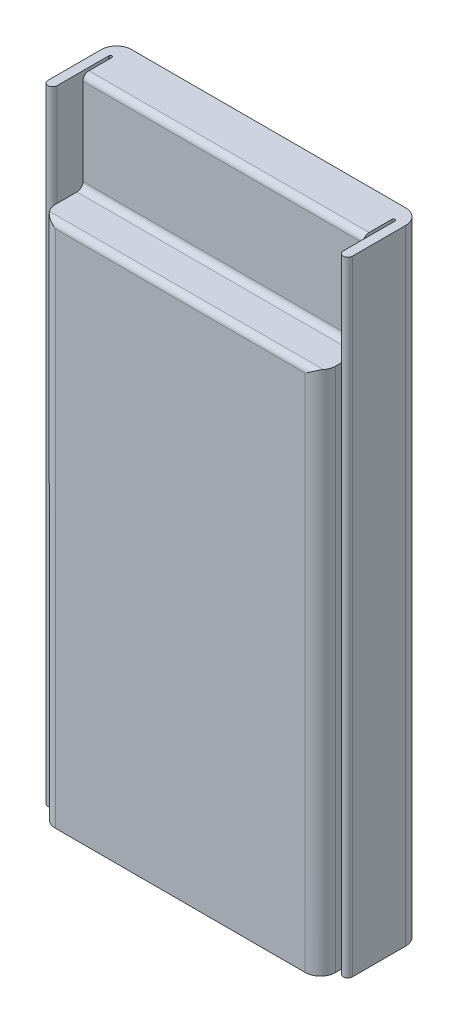
ISO-10303-21;
HEADER;
FILE_DESCRIPTION(('STEP AP214'),'2;1');
FILE_NAME('part.step','',(''),(''),'','','');
FILE_SCHEMA(('AUTOMOTIVE_DESIGN { 1 0 10303 214 1 1 1 1 }'));
ENDSEC;
DATA;
#1=APPLICATION_CONTEXT('core data for automotive mechanical design processes');
#2=APPLICATION_PROTOCOL_DEFINITION('international standard','automotive_design',2000,#1);
#3=PRODUCT_CONTEXT('',#1,'mechanical');
#4=PRODUCT('Part','Part','',(#3));
#5=PRODUCT_RELATED_PRODUCT_CATEGORY('part','',(#4));
#6=PRODUCT_DEFINITION_FORMATION('','',#4);
#7=PRODUCT_DEFINITION_CONTEXT('part definition',#1,'design');
#8=PRODUCT_DEFINITION('design','',#6,#7);
#9=PRODUCT_DEFINITION_SHAPE('','',#8);
#10=(LENGTH_UNIT() NAMED_UNIT(*) SI_UNIT(.MILLI.,.METRE.));
#11=(NAMED_UNIT(*) PLANE_ANGLE_UNIT() SI_UNIT($,.RADIAN.));
#12=(NAMED_UNIT(*) SI_UNIT($,.STERADIAN.) SOLID_ANGLE_UNIT());
#13=UNCERTAINTY_MEASURE_WITH_UNIT(LENGTH_MEASURE(1.E-05),#10,'distance_accuracy_value','');
#14=(GEOMETRIC_REPRESENTATION_CONTEXT(3) GLOBAL_UNCERTAINTY_ASSIGNED_CONTEXT((#13)) GLOBAL_UNIT_ASSIGNED_CONTEXT((#10,
#11,#12)) REPRESENTATION_CONTEXT('',''));
#15=CARTESIAN_POINT('',(0.,0.,0.));
#16=DIRECTION('',(0.,0.,1.));
#17=DIRECTION('',(1.,0.,0.));
#18=AXIS2_PLACEMENT_3D('',#15,#16,#17);
#19=CARTESIAN_POINT('',(-9.2,20.5,4.8));
#20=DIRECTION('',(1.,0.,0.));
#21=DIRECTION('',(0.,0.,-1.));
#22=AXIS2_PLACEMENT_3D('',#19,#20,#21);
#23=PLANE('',#22);
#24=CARTESIAN_POINT('',(-9.2,20.1,2.6));
#25=DIRECTION('',(1.,0.,0.));
#26=DIRECTION('',(0.,0.,-1.));
#27=AXIS2_PLACEMENT_3D('',#24,#25,#26);
#28=CIRCLE('',#27,0.400000000000001);
#29=CARTESIAN_POINT('',(-9.2,20.5,2.6));
#30=VERTEX_POINT('',#29);
#31=CARTESIAN_POINT('',(-9.2,20.1,3.));
#32=VERTEX_POINT('',#31);
#33=EDGE_CURVE('E320',#30,#32,#28,.T.);
#34=ORIENTED_EDGE('',*,*,#33,.F.);
#35=DIRECTION('',(0.,0.,1.));
#36=VECTOR('',#35,1.);
#37=CARTESIAN_POINT('',(-9.2,20.5,4.8));
#38=LINE('',#37,#36);
#39=CARTESIAN_POINT('',(-9.2,20.5,1.1));
#40=VERTEX_POINT('',#39);
#41=EDGE_CURVE('E269',#40,#30,#38,.T.);
#42=ORIENTED_EDGE('',*,*,#41,.F.);
#43=DIRECTION('',(0.,-1.,0.));
#44=VECTOR('',#43,1.);
#45=CARTESIAN_POINT('',(-9.2,20.5,1.1));
#46=LINE('',#45,#44);
#47=CARTESIAN_POINT('',(-9.2,-20.5,1.1));
#48=VERTEX_POINT('',#47);
#49=EDGE_CURVE('E237',#40,#48,#46,.T.);
#50=ORIENTED_EDGE('',*,*,#49,.T.);
#51=DIRECTION('',(0.,0.,1.));
#52=VECTOR('',#51,1.);
#53=CARTESIAN_POINT('',(-9.2,-20.5,4.8));
#54=LINE('',#53,#52);
#55=CARTESIAN_POINT('',(-9.2,-20.5,4.8));
#56=VERTEX_POINT('',#55);
#57=EDGE_CURVE('E192',#48,#56,#54,.T.);
#58=ORIENTED_EDGE('',*,*,#57,.T.);
#59=DIRECTION('',(0.,-1.,0.));
#60=VECTOR('',#59,1.);
#61=CARTESIAN_POINT('',(-9.2,20.5,4.8));
#62=LINE('',#61,#60);
#63=CARTESIAN_POINT('',(-9.2,14.,4.8));
#64=VERTEX_POINT('',#63);
#65=EDGE_CURVE('E235',#64,#56,#62,.T.);
#66=ORIENTED_EDGE('',*,*,#65,.F.);
#67=DIRECTION('',(0.,0.,1.));
#68=VECTOR('',#67,1.);
#69=CARTESIAN_POINT('',(-9.2,14.,3.4));
#70=LINE('',#69,#68);
#71=CARTESIAN_POINT('',(-9.2,14.,3.4));
#72=VERTEX_POINT('',#71);
#73=EDGE_CURVE('E551',#72,#64,#70,.T.);
#74=ORIENTED_EDGE('',*,*,#73,.F.);
#75=CARTESIAN_POINT('',(-9.2,14.4,3.4));
#76=DIRECTION('',(1.,0.,0.));
#77=DIRECTION('',(0.,0.,-1.));
#78=AXIS2_PLACEMENT_3D('',#75,#76,#77);
#79=CIRCLE('',#78,0.4);
#80=CARTESIAN_POINT('',(-9.2,14.4,3.));
#81=VERTEX_POINT('',#80);
#82=EDGE_CURVE('E565',#81,#72,#79,.F.);
#83=ORIENTED_EDGE('',*,*,#82,.F.);
#84=DIRECTION('',(0.,-1.,0.));
#85=VECTOR('',#84,1.);
#86=CARTESIAN_POINT('',(-9.2,20.1,3.));
#87=LINE('',#86,#85);
#88=EDGE_CURVE('E568',#32,#81,#87,.T.);
#89=ORIENTED_EDGE('',*,*,#88,.F.);
#90=EDGE_LOOP('',(#34,#42,#50,#58,#66,#74,#83,#89));
#91=FACE_BOUND('',#90,.T.);
#92=ADVANCED_FACE('F35',(#91),#23,.F.);
#93=CARTESIAN_POINT('',(-8.2,20.5,4.8));
#94=DIRECTION('',(0.,-1.,0.));
#95=DIRECTION('',(0.,0.,-1.));
#96=AXIS2_PLACEMENT_3D('',#93,#94,#95);
#97=CYLINDRICAL_SURFACE('',#96,1.);
#98=CARTESIAN_POINT('',(-9.,14.,5.4));
#99=CARTESIAN_POINT('',(-8.97946555578519,13.999963502659,5.42742158688643));
#100=CARTESIAN_POINT('',(-8.95759830631048,13.997191577115,5.45360470949974));
#101=CARTESIAN_POINT('',(-8.91200033520255,13.9873375955562,5.5029645742072));
#102=CARTESIAN_POINT('',(-8.88828992837434,13.9802979548521,5.5261682126742));
#103=CARTESIAN_POINT('',(-8.82900594180071,13.9593597466306,5.57879996658453));
#104=CARTESIAN_POINT('',(-8.79266811241833,13.9438182116337,5.6066906262616));
#105=CARTESIAN_POINT('',(-8.71791017121064,13.9083623370661,5.65662413275789));
#106=CARTESIAN_POINT('',(-8.67947861979782,13.8884216722672,5.67862993057854));
#107=CARTESIAN_POINT('',(-8.58519541916724,13.8368522731022,5.72488471521433));
#108=CARTESIAN_POINT('',(-8.52872579474069,13.8038047508953,5.7462829915298));
#109=CARTESIAN_POINT('',(-8.41473104532002,13.7349288005911,5.77846495796601));
#110=CARTESIAN_POINT('',(-8.3572080468762,13.6991055857251,5.78926805013529));
#111=CARTESIAN_POINT('',(-8.2681605265798,13.6431017838825,5.79817080641198));
#112=CARTESIAN_POINT('',(-8.23675096803131,13.6232429928825,5.79981786747484));
#113=CARTESIAN_POINT('',(-8.20356347320432,13.6022537396361,5.79999523668233));
#114=CARTESIAN_POINT('',(-8.20178172569562,13.6011268636092,5.79999999807849));
#115=CARTESIAN_POINT('',(-8.2,13.6,5.8));
#116=B_SPLINE_CURVE_WITH_KNOTS('',3,(#98,#99,#100,#101,#102,#103,#104,#105,#106,#107,#108,#109,
#110,#111,#112,#113,#114,#115),.UNSPECIFIED.,.F.,.F.,(4,2,2,2,2,2,2,2,4),(0.,0.102339866834812,
0.203678917670562,0.348024697625991,0.493258904873182,0.698689883440692,0.903743967608915,
1.01522241349045,1.02154698494518),.UNSPECIFIED.);
#117=CARTESIAN_POINT('',(-9.,14.,5.4));
#118=VERTEX_POINT('',#117);
#119=CARTESIAN_POINT('',(-8.2,13.6,5.8));
#120=VERTEX_POINT('',#119);
#121=EDGE_CURVE('E538',#118,#120,#116,.T.);
#122=ORIENTED_EDGE('',*,*,#121,.F.);
#123=CARTESIAN_POINT('',(-8.2,14.,4.8));
#124=DIRECTION('',(0.,-1.,0.));
#125=DIRECTION('',(0.,0.,-1.));
#126=AXIS2_PLACEMENT_3D('',#123,#124,#125);
#127=CIRCLE('',#126,1.);
#128=EDGE_CURVE('E547',#64,#118,#127,.F.);
#129=ORIENTED_EDGE('',*,*,#128,.F.);
#130=ORIENTED_EDGE('',*,*,#65,.T.);
#131=CARTESIAN_POINT('',(-8.2,-20.5,4.8));
#132=DIRECTION('',(0.,1.,0.));
#133=DIRECTION('',(0.,0.,1.));
#134=AXIS2_PLACEMENT_3D('',#131,#132,#133);
#135=CIRCLE('',#134,1.);
#136=CARTESIAN_POINT('',(-8.2,-20.5,5.8));
#137=VERTEX_POINT('',#136);
#138=EDGE_CURVE('E195',#56,#137,#135,.T.);
#139=ORIENTED_EDGE('',*,*,#138,.T.);
#140=DIRECTION('',(0.,-1.,0.));
#141=VECTOR('',#140,1.);
#142=CARTESIAN_POINT('',(-8.2,20.5,5.8));
#143=LINE('',#142,#141);
#144=EDGE_CURVE('E233',#120,#137,#143,.T.);
#145=ORIENTED_EDGE('',*,*,#144,.F.);
#146=EDGE_LOOP('',(#122,#129,#130,#139,#145));
#147=FACE_BOUND('',#146,.T.);
#148=ADVANCED_FACE('F376',(#147),#97,.T.);
#149=CARTESIAN_POINT('',(8.2,20.5,4.8));
#150=DIRECTION('',(0.,-1.,0.));
#151=DIRECTION('',(0.,0.,-1.));
#152=AXIS2_PLACEMENT_3D('',#149,#150,#151);
#153=CYLINDRICAL_SURFACE('',#152,1.);
#154=CARTESIAN_POINT('',(9.,14.,5.4));
#155=CARTESIAN_POINT('',(8.97946555578519,13.999963502659,5.42742158688643));
#156=CARTESIAN_POINT('',(8.95759830631047,13.997191577115,5.45360470949974));
#157=CARTESIAN_POINT('',(8.91200033520254,13.9873375955562,5.50296457420721));
#158=CARTESIAN_POINT('',(8.88828992837433,13.9802979548521,5.5261682126742));
#159=CARTESIAN_POINT('',(8.82900594180071,13.9593597466306,5.57879996658453));
#160=CARTESIAN_POINT('',(8.79266811241833,13.9438182116336,5.6066906262616));
#161=CARTESIAN_POINT('',(8.71791017121064,13.9083623370661,5.65662413275788));
#162=CARTESIAN_POINT('',(8.67947861979781,13.8884216722672,5.67862993057854));
#163=CARTESIAN_POINT('',(8.58519541916724,13.8368522731022,5.72488471521433));
#164=CARTESIAN_POINT('',(8.52872579474073,13.8038047508952,5.7462829915298));
#165=CARTESIAN_POINT('',(8.41473104531996,13.7349288005911,5.77846495796601));
#166=CARTESIAN_POINT('',(8.357208046876,13.6991055857254,5.7892680501353));
#167=CARTESIAN_POINT('',(8.2681605265799,13.6431017838823,5.79817080641197));
#168=CARTESIAN_POINT('',(8.23675096803162,13.623242992882,5.79981786747483));
#169=CARTESIAN_POINT('',(8.20356347320435,13.602253739636,5.79999523668233));
#170=CARTESIAN_POINT('',(8.20178172569563,13.6011268636092,5.79999999807849));
#171=CARTESIAN_POINT('',(8.2,13.6,5.8));
#172=B_SPLINE_CURVE_WITH_KNOTS('',3,(#154,#155,#156,#157,#158,#159,#160,#161,#162,#163,#164,
#165,#166,#167,#168,#169,#170,#171),.UNSPECIFIED.,.F.,.F.,(4,2,2,2,2,2,2,2,4),(0.,
0.102339866834819,0.203678917670562,0.348024697625981,0.493258904873183,0.698689883440703,
0.903743967608915,1.01522241349045,1.02154698494518),.UNSPECIFIED.);
#173=CARTESIAN_POINT('',(9.,14.,5.4));
#174=VERTEX_POINT('',#173);
#175=CARTESIAN_POINT('',(8.2,13.6,5.8));
#176=VERTEX_POINT('',#175);
#177=EDGE_CURVE('E310',#174,#176,#172,.T.);
#178=ORIENTED_EDGE('',*,*,#177,.T.);
#179=DIRECTION('',(0.,-1.,0.));
#180=VECTOR('',#179,1.);
#181=CARTESIAN_POINT('',(8.2,20.5,5.8));
#182=LINE('',#181,#180);
#183=CARTESIAN_POINT('',(8.2,-20.5,5.8));
#184=VERTEX_POINT('',#183);
#185=EDGE_CURVE('E231',#176,#184,#182,.T.);
#186=ORIENTED_EDGE('',*,*,#185,.T.);
#187=CARTESIAN_POINT('',(8.2,-20.5,4.8));
#188=DIRECTION('',(0.,1.,0.));
#189=DIRECTION('',(0.,0.,-1.));
#190=AXIS2_PLACEMENT_3D('',#187,#188,#189);
#191=CIRCLE('',#190,1.);
#192=CARTESIAN_POINT('',(9.2,-20.5,4.8));
#193=VERTEX_POINT('',#192);
#194=EDGE_CURVE('E201',#184,#193,#191,.T.);
#195=ORIENTED_EDGE('',*,*,#194,.T.);
#196=DIRECTION('',(0.,-1.,0.));
#197=VECTOR('',#196,1.);
#198=CARTESIAN_POINT('',(9.2,20.5,4.8));
#199=LINE('',#198,#197);
#200=CARTESIAN_POINT('',(9.2,14.,4.8));
#201=VERTEX_POINT('',#200);
#202=EDGE_CURVE('E229',#201,#193,#199,.T.);
#203=ORIENTED_EDGE('',*,*,#202,.F.);
#204=CARTESIAN_POINT('',(8.2,14.,4.8));
#205=DIRECTION('',(0.,1.,0.));
#206=DIRECTION('',(0.,0.,1.));
#207=AXIS2_PLACEMENT_3D('',#204,#205,#206);
#208=CIRCLE('',#207,1.);
#209=EDGE_CURVE('E317',#201,#174,#208,.F.);
#210=ORIENTED_EDGE('',*,*,#209,.T.);
#211=EDGE_LOOP('',(#178,#186,#195,#203,#210));
#212=FACE_BOUND('',#211,.T.);
#213=ADVANCED_FACE('F372',(#212),#153,.T.);
#214=CARTESIAN_POINT('',(9.2,20.5,1.1));
#215=DIRECTION('',(-1.,0.,0.));
#216=DIRECTION('',(0.,0.,1.));
#217=AXIS2_PLACEMENT_3D('',#214,#215,#216);
#218=PLANE('',#217);
#219=CARTESIAN_POINT('',(9.2,20.1,2.6));
#220=DIRECTION('',(-1.,0.,0.));
#221=DIRECTION('',(0.,0.,1.));
#222=AXIS2_PLACEMENT_3D('',#219,#220,#221);
#223=CIRCLE('',#222,0.400000000000001);
#224=CARTESIAN_POINT('',(9.2,20.5,2.6));
#225=VERTEX_POINT('',#224);
#226=CARTESIAN_POINT('',(9.2,20.1,3.));
#227=VERTEX_POINT('',#226);
#228=EDGE_CURVE('E50',#225,#227,#223,.F.);
#229=ORIENTED_EDGE('',*,*,#228,.T.);
#230=DIRECTION('',(0.,-1.,0.));
#231=VECTOR('',#230,1.);
#232=CARTESIAN_POINT('',(9.2,20.1,3.));
#233=LINE('',#232,#231);
#234=CARTESIAN_POINT('',(9.2,14.4,3.));
#235=VERTEX_POINT('',#234);
#236=EDGE_CURVE('E304',#227,#235,#233,.T.);
#237=ORIENTED_EDGE('',*,*,#236,.T.);
#238=CARTESIAN_POINT('',(9.2,14.4,3.4));
#239=DIRECTION('',(-1.,0.,0.));
#240=DIRECTION('',(0.,0.,1.));
#241=AXIS2_PLACEMENT_3D('',#238,#239,#240);
#242=CIRCLE('',#241,0.4);
#243=CARTESIAN_POINT('',(9.2,14.,3.4));
#244=VERTEX_POINT('',#243);
#245=EDGE_CURVE('E308',#235,#244,#242,.T.);
#246=ORIENTED_EDGE('',*,*,#245,.T.);
#247=DIRECTION('',(0.,0.,1.));
#248=VECTOR('',#247,1.);
#249=CARTESIAN_POINT('',(9.2,14.,3.4));
#250=LINE('',#249,#248);
#251=EDGE_CURVE('E314',#244,#201,#250,.T.);
#252=ORIENTED_EDGE('',*,*,#251,.T.);
#253=ORIENTED_EDGE('',*,*,#202,.T.);
#254=DIRECTION('',(0.,0.,-1.));
#255=VECTOR('',#254,1.);
#256=CARTESIAN_POINT('',(9.2,-20.5,1.1));
#257=LINE('',#256,#255);
#258=CARTESIAN_POINT('',(9.2,-20.5,1.1));
#259=VERTEX_POINT('',#258);
#260=EDGE_CURVE('E204',#193,#259,#257,.T.);
#261=ORIENTED_EDGE('',*,*,#260,.T.);
#262=DIRECTION('',(0.,-1.,0.));
#263=VECTOR('',#262,1.);
#264=CARTESIAN_POINT('',(9.2,20.5,1.1));
#265=LINE('',#264,#263);
#266=CARTESIAN_POINT('',(9.2,20.5,1.1));
#267=VERTEX_POINT('',#266);
#268=EDGE_CURVE('E226',#267,#259,#265,.T.);
#269=ORIENTED_EDGE('',*,*,#268,.F.);
#270=DIRECTION('',(0.,0.,-1.));
#271=VECTOR('',#270,1.);
#272=CARTESIAN_POINT('',(9.2,20.5,1.1));
#273=LINE('',#272,#271);
#274=EDGE_CURVE('E272',#225,#267,#273,.T.);
#275=ORIENTED_EDGE('',*,*,#274,.F.);
#276=EDGE_LOOP('',(#229,#237,#246,#252,#253,#261,#269,#275));
#277=FACE_BOUND('',#276,.T.);
#278=ADVANCED_FACE('F369',(#277),#218,.F.);
#279=CARTESIAN_POINT('',(-9.,20.5,0.999999999999998));
#280=DIRECTION('',(0.,-1.,0.));
#281=DIRECTION('',(0.,0.,-1.));
#282=AXIS2_PLACEMENT_3D('',#279,#280,#281);
#283=CYLINDRICAL_SURFACE('',#282,0.999999999999999);
#284=CARTESIAN_POINT('',(-9.,-20.5,0.999999999999998));
#285=DIRECTION('',(0.,1.,0.));
#286=DIRECTION('',(0.,0.,1.));
#287=AXIS2_PLACEMENT_3D('',#284,#285,#286);
#288=CIRCLE('',#287,0.999999999999999);
#289=CARTESIAN_POINT('',(-9.,-20.5,0.));
#290=VERTEX_POINT('',#289);
#291=CARTESIAN_POINT('',(-10.,-20.5,1.));
#292=VERTEX_POINT('',#291);
#293=EDGE_CURVE('E180',#290,#292,#288,.T.);
#294=ORIENTED_EDGE('',*,*,#293,.T.);
#295=DIRECTION('',(0.,-1.,0.));
#296=VECTOR('',#295,1.);
#297=CARTESIAN_POINT('',(-10.,20.5,1.));
#298=LINE('',#297,#296);
#299=CARTESIAN_POINT('',(-10.,20.5,1.));
#300=VERTEX_POINT('',#299);
#301=EDGE_CURVE('E11',#300,#292,#298,.T.);
#302=ORIENTED_EDGE('',*,*,#301,.F.);
#303=CARTESIAN_POINT('',(-9.,20.5,0.999999999999998));
#304=DIRECTION('',(0.,1.,0.));
#305=DIRECTION('',(0.,0.,1.));
#306=AXIS2_PLACEMENT_3D('',#303,#304,#305);
#307=CIRCLE('',#306,0.999999999999999);
#308=CARTESIAN_POINT('',(-9.,20.5,0.));
#309=VERTEX_POINT('',#308);
#310=EDGE_CURVE('E216',#309,#300,#307,.T.);
#311=ORIENTED_EDGE('',*,*,#310,.F.);
#312=DIRECTION('',(0.,-1.,0.));
#313=VECTOR('',#312,1.);
#314=CARTESIAN_POINT('',(-9.,20.5,0.));
#315=LINE('',#314,#313);
#316=EDGE_CURVE('E176',#309,#290,#315,.T.);
#317=ORIENTED_EDGE('',*,*,#316,.T.);
#318=EDGE_LOOP('',(#294,#302,#311,#317));
#319=FACE_BOUND('',#318,.T.);
#320=ADVANCED_FACE('F37',(#319),#283,.T.);
#321=CARTESIAN_POINT('',(-10.,20.5,1.));
#322=DIRECTION('',(1.,0.,0.));
#323=DIRECTION('',(0.,0.,-1.));
#324=AXIS2_PLACEMENT_3D('',#321,#322,#323);
#325=PLANE('',#324);
#326=DIRECTION('',(0.,0.,1.));
#327=VECTOR('',#326,1.);
#328=CARTESIAN_POINT('',(-10.,-20.5,1.));
#329=LINE('',#328,#327);
#330=CARTESIAN_POINT('',(-10.,-20.5,4.5));
#331=VERTEX_POINT('',#330);
#332=EDGE_CURVE('E183',#292,#331,#329,.T.);
#333=ORIENTED_EDGE('',*,*,#332,.T.);
#334=DIRECTION('',(0.,-1.,0.));
#335=VECTOR('',#334,1.);
#336=CARTESIAN_POINT('',(-10.,20.5,4.5));
#337=LINE('',#336,#335);
#338=CARTESIAN_POINT('',(-10.,20.5,4.5));
#339=VERTEX_POINT('',#338);
#340=EDGE_CURVE('E43',#339,#331,#337,.T.);
#341=ORIENTED_EDGE('',*,*,#340,.F.);
#342=DIRECTION('',(0.,0.,1.));
#343=VECTOR('',#342,1.);
#344=CARTESIAN_POINT('',(-10.,20.5,1.));
#345=LINE('',#344,#343);
#346=EDGE_CURVE('E124',#300,#339,#345,.T.);
#347=ORIENTED_EDGE('',*,*,#346,.F.);
#348=ORIENTED_EDGE('',*,*,#301,.T.);
#349=EDGE_LOOP('',(#333,#341,#347,#348));
#350=FACE_BOUND('',#349,.T.);
#351=ADVANCED_FACE('F392',(#350),#325,.F.);
#352=CARTESIAN_POINT('',(-9.7,20.5,4.5));
#353=DIRECTION('',(0.,-1.,0.));
#354=DIRECTION('',(0.,0.,-1.));
#355=AXIS2_PLACEMENT_3D('',#352,#353,#354);
#356=CYLINDRICAL_SURFACE('',#355,0.300000000000002);
#357=CARTESIAN_POINT('',(-9.7,-20.5,4.5));
#358=DIRECTION('',(0.,1.,0.));
#359=DIRECTION('',(0.,0.,1.));
#360=AXIS2_PLACEMENT_3D('',#357,#358,#359);
#361=CIRCLE('',#360,0.300000000000002);
#362=CARTESIAN_POINT('',(-9.4,-20.5,4.5));
#363=VERTEX_POINT('',#362);
#364=EDGE_CURVE('E186',#331,#363,#361,.T.);
#365=ORIENTED_EDGE('',*,*,#364,.T.);
#366=DIRECTION('',(0.,-1.,0.));
#367=VECTOR('',#366,1.);
#368=CARTESIAN_POINT('',(-9.4,20.5,4.5));
#369=LINE('',#368,#367);
#370=CARTESIAN_POINT('',(-9.4,20.5,4.5));
#371=VERTEX_POINT('',#370);
#372=EDGE_CURVE('E243',#371,#363,#369,.T.);
#373=ORIENTED_EDGE('',*,*,#372,.F.);
#374=CARTESIAN_POINT('',(-9.7,20.5,4.5));
#375=DIRECTION('',(0.,1.,0.));
#376=DIRECTION('',(0.,0.,1.));
#377=AXIS2_PLACEMENT_3D('',#374,#375,#376);
#378=CIRCLE('',#377,0.300000000000002);
#379=EDGE_CURVE('E251',#339,#371,#378,.T.);
#380=ORIENTED_EDGE('',*,*,#379,.F.);
#381=ORIENTED_EDGE('',*,*,#340,.T.);
#382=EDGE_LOOP('',(#365,#373,#380,#381));
#383=FACE_BOUND('',#382,.T.);
#384=ADVANCED_FACE('F249',(#383),#356,.T.);
#385=CARTESIAN_POINT('',(-9.4,20.5,4.5));
#386=DIRECTION('',(-1.,0.,0.));
#387=DIRECTION('',(0.,0.,1.));
#388=AXIS2_PLACEMENT_3D('',#385,#386,#387);
#389=PLANE('',#388);
#390=DIRECTION('',(0.,0.,-1.));
#391=VECTOR('',#390,1.);
#392=CARTESIAN_POINT('',(-9.4,-20.5,4.5));
#393=LINE('',#392,#391);
#394=CARTESIAN_POINT('',(-9.4,-20.5,1.1));
#395=VERTEX_POINT('',#394);
#396=EDGE_CURVE('E188',#363,#395,#393,.T.);
#397=ORIENTED_EDGE('',*,*,#396,.T.);
#398=DIRECTION('',(0.,-1.,0.));
#399=VECTOR('',#398,1.);
#400=CARTESIAN_POINT('',(-9.4,20.5,1.1));
#401=LINE('',#400,#399);
#402=CARTESIAN_POINT('',(-9.4,20.5,1.1));
#403=VERTEX_POINT('',#402);
#404=EDGE_CURVE('E240',#403,#395,#401,.T.);
#405=ORIENTED_EDGE('',*,*,#404,.F.);
#406=DIRECTION('',(0.,0.,-1.));
#407=VECTOR('',#406,1.);
#408=CARTESIAN_POINT('',(-9.4,20.5,4.5));
#409=LINE('',#408,#407);
#410=EDGE_CURVE('E270',#371,#403,#409,.T.);
#411=ORIENTED_EDGE('',*,*,#410,.F.);
#412=ORIENTED_EDGE('',*,*,#372,.T.);
#413=EDGE_LOOP('',(#397,#405,#411,#412));
#414=FACE_BOUND('',#413,.T.);
#415=ADVANCED_FACE('F260',(#414),#389,.F.);
#416=CARTESIAN_POINT('',(-9.3,20.5,1.1));
#417=DIRECTION('',(0.,-1.,0.));
#418=DIRECTION('',(0.,0.,-1.));
#419=AXIS2_PLACEMENT_3D('',#416,#417,#418);
#420=CYLINDRICAL_SURFACE('',#419,0.0999999999999977);
#421=CARTESIAN_POINT('',(-9.3,-20.5,1.1));
#422=DIRECTION('',(0.,-1.,0.));
#423=DIRECTION('',(0.,0.,1.));
#424=AXIS2_PLACEMENT_3D('',#421,#422,#423);
#425=CIRCLE('',#424,0.0999999999999977);
#426=EDGE_CURVE('E190',#395,#48,#425,.T.);
#427=ORIENTED_EDGE('',*,*,#426,.T.);
#428=ORIENTED_EDGE('',*,*,#49,.F.);
#429=CARTESIAN_POINT('',(-9.3,20.5,1.1));
#430=DIRECTION('',(0.,-1.,0.));
#431=DIRECTION('',(0.,0.,1.));
#432=AXIS2_PLACEMENT_3D('',#429,#430,#431);
#433=CIRCLE('',#432,0.0999999999999977);
#434=EDGE_CURVE('E266',#403,#40,#433,.T.);
#435=ORIENTED_EDGE('',*,*,#434,.F.);
#436=ORIENTED_EDGE('',*,*,#404,.T.);
#437=EDGE_LOOP('',(#427,#428,#435,#436));
#438=FACE_BOUND('',#437,.T.);
#439=ADVANCED_FACE('F264',(#438),#420,.F.);
#440=CARTESIAN_POINT('',(-8.2,20.5,5.8));
#441=DIRECTION('',(0.,0.,-1.));
#442=DIRECTION('',(-1.,0.,0.));
#443=AXIS2_PLACEMENT_3D('',#440,#441,#442);
#444=PLANE('',#443);
#445=ORIENTED_EDGE('',*,*,#185,.F.);
#446=DIRECTION('',(-1.,0.,0.));
#447=VECTOR('',#446,1.);
#448=CARTESIAN_POINT('',(10.001,13.6,5.8));
#449=LINE('',#448,#447);
#450=EDGE_CURVE('E318',#176,#120,#449,.T.);
#451=ORIENTED_EDGE('',*,*,#450,.T.);
#452=ORIENTED_EDGE('',*,*,#144,.T.);
#453=DIRECTION('',(1.,0.,0.));
#454=VECTOR('',#453,1.);
#455=CARTESIAN_POINT('',(-8.2,-20.5,5.8));
#456=LINE('',#455,#454);
#457=EDGE_CURVE('E198',#137,#184,#456,.T.);
#458=ORIENTED_EDGE('',*,*,#457,.T.);
#459=EDGE_LOOP('',(#445,#451,#452,#458));
#460=FACE_BOUND('',#459,.T.);
#461=ADVANCED_FACE('F367',(#460),#444,.F.);
#462=CARTESIAN_POINT('',(9.3,20.5,1.1));
#463=DIRECTION('',(0.,-1.,0.));
#464=DIRECTION('',(0.,0.,-1.));
#465=AXIS2_PLACEMENT_3D('',#462,#463,#464);
#466=CYLINDRICAL_SURFACE('',#465,0.0999999999999977);
#467=CARTESIAN_POINT('',(9.3,-20.5,1.1));
#468=DIRECTION('',(0.,-1.,0.));
#469=DIRECTION('',(0.,0.,-1.));
#470=AXIS2_PLACEMENT_3D('',#467,#468,#469);
#471=CIRCLE('',#470,0.0999999999999977);
#472=CARTESIAN_POINT('',(9.39999999999999,-20.5,1.1));
#473=VERTEX_POINT('',#472);
#474=EDGE_CURVE('E206',#259,#473,#471,.T.);
#475=ORIENTED_EDGE('',*,*,#474,.T.);
#476=DIRECTION('',(0.,-1.,0.));
#477=VECTOR('',#476,1.);
#478=CARTESIAN_POINT('',(9.39999999999999,20.5,1.1));
#479=LINE('',#478,#477);
#480=CARTESIAN_POINT('',(9.39999999999999,20.5,1.1));
#481=VERTEX_POINT('',#480);
#482=EDGE_CURVE('E223',#481,#473,#479,.T.);
#483=ORIENTED_EDGE('',*,*,#482,.F.);
#484=CARTESIAN_POINT('',(9.3,20.5,1.1));
#485=DIRECTION('',(0.,-1.,0.));
#486=DIRECTION('',(0.,0.,-1.));
#487=AXIS2_PLACEMENT_3D('',#484,#485,#486);
#488=CIRCLE('',#487,0.0999999999999977);
#489=EDGE_CURVE('E278',#267,#481,#488,.T.);
#490=ORIENTED_EDGE('',*,*,#489,.F.);
#491=ORIENTED_EDGE('',*,*,#268,.T.);
#492=EDGE_LOOP('',(#475,#483,#490,#491));
#493=FACE_BOUND('',#492,.T.);
#494=ADVANCED_FACE('F364',(#493),#466,.F.);
#495=CARTESIAN_POINT('',(9.39999999999998,20.5,4.50000000000001));
#496=DIRECTION('',(1.,0.,0.));
#497=DIRECTION('',(0.,0.,-1.));
#498=AXIS2_PLACEMENT_3D('',#495,#496,#497);
#499=PLANE('',#498);
#500=DIRECTION('',(0.,0.,1.));
#501=VECTOR('',#500,1.);
#502=CARTESIAN_POINT('',(9.39999999999998,-20.5,4.50000000000001));
#503=LINE('',#502,#501);
#504=CARTESIAN_POINT('',(9.39999999999998,-20.5,4.50000000000001));
#505=VERTEX_POINT('',#504);
#506=EDGE_CURVE('E208',#473,#505,#503,.T.);
#507=ORIENTED_EDGE('',*,*,#506,.T.);
#508=DIRECTION('',(0.,-1.,0.));
#509=VECTOR('',#508,1.);
#510=CARTESIAN_POINT('',(9.39999999999998,20.5,4.50000000000001));
#511=LINE('',#510,#509);
#512=CARTESIAN_POINT('',(9.39999999999998,20.5,4.50000000000001));
#513=VERTEX_POINT('',#512);
#514=EDGE_CURVE('E220',#513,#505,#511,.T.);
#515=ORIENTED_EDGE('',*,*,#514,.F.);
#516=DIRECTION('',(0.,0.,1.));
#517=VECTOR('',#516,1.);
#518=CARTESIAN_POINT('',(9.39999999999998,20.5,4.50000000000001));
#519=LINE('',#518,#517);
#520=EDGE_CURVE('E280',#481,#513,#519,.T.);
#521=ORIENTED_EDGE('',*,*,#520,.F.);
#522=ORIENTED_EDGE('',*,*,#482,.T.);
#523=EDGE_LOOP('',(#507,#515,#521,#522));
#524=FACE_BOUND('',#523,.T.);
#525=ADVANCED_FACE('F286',(#524),#499,.F.);
#526=CARTESIAN_POINT('',(9.69999999999999,20.5,4.50000000000001));
#527=DIRECTION('',(0.,-1.,0.));
#528=DIRECTION('',(0.,0.,-1.));
#529=AXIS2_PLACEMENT_3D('',#526,#527,#528);
#530=CYLINDRICAL_SURFACE('',#529,0.300000000000009);
#531=CARTESIAN_POINT('',(9.69999999999999,-20.5,4.50000000000001));
#532=DIRECTION('',(0.,1.,0.));
#533=DIRECTION('',(0.,0.,-1.));
#534=AXIS2_PLACEMENT_3D('',#531,#532,#533);
#535=CIRCLE('',#534,0.300000000000009);
#536=CARTESIAN_POINT('',(10.,-20.5,4.50000000000001));
#537=VERTEX_POINT('',#536);
#538=EDGE_CURVE('E210',#505,#537,#535,.T.);
#539=ORIENTED_EDGE('',*,*,#538,.T.);
#540=DIRECTION('',(0.,-1.,0.));
#541=VECTOR('',#540,1.);
#542=CARTESIAN_POINT('',(10.,20.5,4.50000000000001));
#543=LINE('',#542,#541);
#544=CARTESIAN_POINT('',(10.,20.5,4.50000000000001));
#545=VERTEX_POINT('',#544);
#546=EDGE_CURVE('E171',#545,#537,#543,.T.);
#547=ORIENTED_EDGE('',*,*,#546,.F.);
#548=CARTESIAN_POINT('',(9.69999999999999,20.5,4.50000000000001));
#549=DIRECTION('',(0.,1.,0.));
#550=DIRECTION('',(0.,0.,-1.));
#551=AXIS2_PLACEMENT_3D('',#548,#549,#550);
#552=CIRCLE('',#551,0.300000000000009);
#553=EDGE_CURVE('E159',#513,#545,#552,.T.);
#554=ORIENTED_EDGE('',*,*,#553,.F.);
#555=ORIENTED_EDGE('',*,*,#514,.T.);
#556=EDGE_LOOP('',(#539,#547,#554,#555));
#557=FACE_BOUND('',#556,.T.);
#558=ADVANCED_FACE('F290',(#557),#530,.T.);
#559=CARTESIAN_POINT('',(10.,20.5,1.));
#560=DIRECTION('',(-1.,0.,0.));
#561=DIRECTION('',(0.,0.,1.));
#562=AXIS2_PLACEMENT_3D('',#559,#560,#561);
#563=PLANE('',#562);
#564=DIRECTION('',(0.,0.,-1.));
#565=VECTOR('',#564,1.);
#566=CARTESIAN_POINT('',(10.,-20.5,1.));
#567=LINE('',#566,#565);
#568=CARTESIAN_POINT('',(10.,-20.5,1.));
#569=VERTEX_POINT('',#568);
#570=EDGE_CURVE('E168',#537,#569,#567,.T.);
#571=ORIENTED_EDGE('',*,*,#570,.T.);
#572=DIRECTION('',(0.,-1.,0.));
#573=VECTOR('',#572,1.);
#574=CARTESIAN_POINT('',(10.,20.5,1.));
#575=LINE('',#574,#573);
#576=CARTESIAN_POINT('',(10.,20.5,1.));
#577=VERTEX_POINT('',#576);
#578=EDGE_CURVE('E165',#577,#569,#575,.T.);
#579=ORIENTED_EDGE('',*,*,#578,.F.);
#580=DIRECTION('',(0.,0.,-1.));
#581=VECTOR('',#580,1.);
#582=CARTESIAN_POINT('',(10.,20.5,1.));
#583=LINE('',#582,#581);
#584=EDGE_CURVE('E152',#545,#577,#583,.T.);
#585=ORIENTED_EDGE('',*,*,#584,.F.);
#586=ORIENTED_EDGE('',*,*,#546,.T.);
#587=EDGE_LOOP('',(#571,#579,#585,#586));
#588=FACE_BOUND('',#587,.T.);
#589=ADVANCED_FACE('F166',(#588),#563,.F.);
#590=CARTESIAN_POINT('',(9.,20.5,1.));
#591=DIRECTION('',(0.,-1.,0.));
#592=DIRECTION('',(0.,0.,-1.));
#593=AXIS2_PLACEMENT_3D('',#590,#591,#592);
#594=CYLINDRICAL_SURFACE('',#593,1.);
#595=CARTESIAN_POINT('',(9.,-20.5,1.));
#596=DIRECTION('',(0.,1.,0.));
#597=DIRECTION('',(0.,0.,-1.));
#598=AXIS2_PLACEMENT_3D('',#595,#596,#597);
#599=CIRCLE('',#598,1.);
#600=CARTESIAN_POINT('',(9.,-20.5,0.));
#601=VERTEX_POINT('',#600);
#602=EDGE_CURVE('E213',#569,#601,#599,.T.);
#603=ORIENTED_EDGE('',*,*,#602,.T.);
#604=DIRECTION('',(0.,-1.,0.));
#605=VECTOR('',#604,1.);
#606=CARTESIAN_POINT('',(9.,20.5,0.));
#607=LINE('',#606,#605);
#608=CARTESIAN_POINT('',(9.,20.5,0.));
#609=VERTEX_POINT('',#608);
#610=EDGE_CURVE('E172',#609,#601,#607,.T.);
#611=ORIENTED_EDGE('',*,*,#610,.F.);
#612=CARTESIAN_POINT('',(9.,20.5,1.));
#613=DIRECTION('',(0.,1.,0.));
#614=DIRECTION('',(0.,0.,-1.));
#615=AXIS2_PLACEMENT_3D('',#612,#613,#614);
#616=CIRCLE('',#615,1.);
#617=EDGE_CURVE('E156',#577,#609,#616,.T.);
#618=ORIENTED_EDGE('',*,*,#617,.F.);
#619=ORIENTED_EDGE('',*,*,#578,.T.);
#620=EDGE_LOOP('',(#603,#611,#618,#619));
#621=FACE_BOUND('',#620,.T.);
#622=ADVANCED_FACE('F174',(#621),#594,.T.);
#623=CARTESIAN_POINT('',(-9.,20.5,0.));
#624=DIRECTION('',(0.,0.,1.));
#625=DIRECTION('',(1.,0.,0.));
#626=AXIS2_PLACEMENT_3D('',#623,#624,#625);
#627=PLANE('',#626);
#628=DIRECTION('',(-1.,0.,0.));
#629=VECTOR('',#628,1.);
#630=CARTESIAN_POINT('',(-9.,-20.5,0.));
#631=LINE('',#630,#629);
#632=EDGE_CURVE('E116',#601,#290,#631,.T.);
#633=ORIENTED_EDGE('',*,*,#632,.T.);
#634=ORIENTED_EDGE('',*,*,#316,.F.);
#635=DIRECTION('',(-1.,0.,0.));
#636=VECTOR('',#635,1.);
#637=CARTESIAN_POINT('',(-9.,20.5,0.));
#638=LINE('',#637,#636);
#639=EDGE_CURVE('E59',#609,#309,#638,.T.);
#640=ORIENTED_EDGE('',*,*,#639,.F.);
#641=ORIENTED_EDGE('',*,*,#610,.T.);
#642=EDGE_LOOP('',(#633,#634,#640,#641));
#643=FACE_BOUND('',#642,.T.);
#644=ADVANCED_FACE('F291',(#643),#627,.F.);
#645=CARTESIAN_POINT('',(-9.,20.5,0.999999999999998));
#646=DIRECTION('',(0.,1.,0.));
#647=DIRECTION('',(0.,0.,1.));
#648=AXIS2_PLACEMENT_3D('',#645,#646,#647);
#649=PLANE('',#648);
#650=DIRECTION('',(-1.,0.,0.));
#651=VECTOR('',#650,1.);
#652=CARTESIAN_POINT('',(10.001,20.5,2.6));
#653=LINE('',#652,#651);
#654=EDGE_CURVE('E301',#225,#30,#653,.T.);
#655=ORIENTED_EDGE('',*,*,#654,.F.);
#656=ORIENTED_EDGE('',*,*,#274,.T.);
#657=ORIENTED_EDGE('',*,*,#489,.T.);
#658=ORIENTED_EDGE('',*,*,#520,.T.);
#659=ORIENTED_EDGE('',*,*,#553,.T.);
#660=ORIENTED_EDGE('',*,*,#584,.T.);
#661=ORIENTED_EDGE('',*,*,#617,.T.);
#662=ORIENTED_EDGE('',*,*,#639,.T.);
#663=ORIENTED_EDGE('',*,*,#310,.T.);
#664=ORIENTED_EDGE('',*,*,#346,.T.);
#665=ORIENTED_EDGE('',*,*,#379,.T.);
#666=ORIENTED_EDGE('',*,*,#410,.T.);
#667=ORIENTED_EDGE('',*,*,#434,.T.);
#668=ORIENTED_EDGE('',*,*,#41,.T.);
#669=EDGE_LOOP('',(#655,#656,#657,#658,#659,#660,#661,#662,#663,#664,#665,#666,#667,#668));
#670=FACE_BOUND('',#669,.T.);
#671=ADVANCED_FACE('F154',(#670),#649,.T.);
#672=CARTESIAN_POINT('',(-9.,-20.5,0.999999999999998));
#673=DIRECTION('',(0.,1.,0.));
#674=DIRECTION('',(0.,0.,1.));
#675=AXIS2_PLACEMENT_3D('',#672,#673,#674);
#676=PLANE('',#675);
#677=ORIENTED_EDGE('',*,*,#293,.F.);
#678=ORIENTED_EDGE('',*,*,#632,.F.);
#679=ORIENTED_EDGE('',*,*,#602,.F.);
#680=ORIENTED_EDGE('',*,*,#570,.F.);
#681=ORIENTED_EDGE('',*,*,#538,.F.);
#682=ORIENTED_EDGE('',*,*,#506,.F.);
#683=ORIENTED_EDGE('',*,*,#474,.F.);
#684=ORIENTED_EDGE('',*,*,#260,.F.);
#685=ORIENTED_EDGE('',*,*,#194,.F.);
#686=ORIENTED_EDGE('',*,*,#457,.F.);
#687=ORIENTED_EDGE('',*,*,#138,.F.);
#688=ORIENTED_EDGE('',*,*,#57,.F.);
#689=ORIENTED_EDGE('',*,*,#426,.F.);
#690=ORIENTED_EDGE('',*,*,#396,.F.);
#691=ORIENTED_EDGE('',*,*,#364,.F.);
#692=ORIENTED_EDGE('',*,*,#332,.F.);
#693=EDGE_LOOP('',(#677,#678,#679,#680,#681,#682,#683,#684,#685,#686,#687,#688,#689,#690,#691,#692));
#694=FACE_BOUND('',#693,.T.);
#695=ADVANCED_FACE('F255',(#694),#676,.F.);
#696=CARTESIAN_POINT('',(10.001,20.1,2.6));
#697=DIRECTION('',(-1.,0.,0.));
#698=DIRECTION('',(0.,0.,1.));
#699=AXIS2_PLACEMENT_3D('',#696,#697,#698);
#700=CYLINDRICAL_SURFACE('',#699,0.400000000000001);
#701=ORIENTED_EDGE('',*,*,#654,.T.);
#702=ORIENTED_EDGE('',*,*,#33,.T.);
#703=DIRECTION('',(-1.,0.,0.));
#704=VECTOR('',#703,1.);
#705=CARTESIAN_POINT('',(10.001,20.1,3.));
#706=LINE('',#705,#704);
#707=EDGE_CURVE('E298',#227,#32,#706,.T.);
#708=ORIENTED_EDGE('',*,*,#707,.F.);
#709=ORIENTED_EDGE('',*,*,#228,.F.);
#710=EDGE_LOOP('',(#701,#702,#708,#709));
#711=FACE_BOUND('',#710,.T.);
#712=ADVANCED_FACE('F347',(#711),#700,.T.);
#713=CARTESIAN_POINT('',(10.001,13.6,5.4));
#714=DIRECTION('',(-1.,0.,0.));
#715=DIRECTION('',(0.,0.,1.));
#716=AXIS2_PLACEMENT_3D('',#713,#714,#715);
#717=CYLINDRICAL_SURFACE('',#716,0.400000000000001);
#718=DIRECTION('',(-1.,0.,0.));
#719=VECTOR('',#718,1.);
#720=CARTESIAN_POINT('',(10.001,14.,5.4));
#721=LINE('',#720,#719);
#722=EDGE_CURVE('E313',#174,#118,#721,.T.);
#723=ORIENTED_EDGE('',*,*,#722,.T.);
#724=ORIENTED_EDGE('',*,*,#121,.T.);
#725=ORIENTED_EDGE('',*,*,#450,.F.);
#726=ORIENTED_EDGE('',*,*,#177,.F.);
#727=EDGE_LOOP('',(#723,#724,#725,#726));
#728=FACE_BOUND('',#727,.T.);
#729=ADVANCED_FACE('F330',(#728),#717,.T.);
#730=CARTESIAN_POINT('',(10.001,14.,3.4));
#731=DIRECTION('',(0.,1.,0.));
#732=DIRECTION('',(0.,0.,1.));
#733=AXIS2_PLACEMENT_3D('',#730,#731,#732);
#734=PLANE('',#733);
#735=ORIENTED_EDGE('',*,*,#251,.F.);
#736=DIRECTION('',(-1.,0.,0.));
#737=VECTOR('',#736,1.);
#738=CARTESIAN_POINT('',(10.001,14.,3.4));
#739=LINE('',#738,#737);
#740=EDGE_CURVE('E305',#244,#72,#739,.T.);
#741=ORIENTED_EDGE('',*,*,#740,.T.);
#742=ORIENTED_EDGE('',*,*,#73,.T.);
#743=ORIENTED_EDGE('',*,*,#128,.T.);
#744=ORIENTED_EDGE('',*,*,#722,.F.);
#745=ORIENTED_EDGE('',*,*,#209,.F.);
#746=EDGE_LOOP('',(#735,#741,#742,#743,#744,#745));
#747=FACE_BOUND('',#746,.T.);
#748=ADVANCED_FACE('F342',(#747),#734,.T.);
#749=CARTESIAN_POINT('',(10.001,14.4,3.4));
#750=DIRECTION('',(-1.,0.,0.));
#751=DIRECTION('',(0.,0.,1.));
#752=AXIS2_PLACEMENT_3D('',#749,#750,#751);
#753=CYLINDRICAL_SURFACE('',#752,0.4);
#754=DIRECTION('',(-1.,0.,0.));
#755=VECTOR('',#754,1.);
#756=CARTESIAN_POINT('',(10.001,14.4,3.));
#757=LINE('',#756,#755);
#758=EDGE_CURVE('E184',#235,#81,#757,.T.);
#759=ORIENTED_EDGE('',*,*,#758,.T.);
#760=ORIENTED_EDGE('',*,*,#82,.T.);
#761=ORIENTED_EDGE('',*,*,#740,.F.);
#762=ORIENTED_EDGE('',*,*,#245,.F.);
#763=EDGE_LOOP('',(#759,#760,#761,#762));
#764=FACE_BOUND('',#763,.T.);
#765=ADVANCED_FACE('F338',(#764),#753,.F.);
#766=CARTESIAN_POINT('',(10.001,20.1,3.));
#767=DIRECTION('',(0.,0.,1.));
#768=DIRECTION('',(0.,-1.,0.));
#769=AXIS2_PLACEMENT_3D('',#766,#767,#768);
#770=PLANE('',#769);
#771=ORIENTED_EDGE('',*,*,#707,.T.);
#772=ORIENTED_EDGE('',*,*,#88,.T.);
#773=ORIENTED_EDGE('',*,*,#758,.F.);
#774=ORIENTED_EDGE('',*,*,#236,.F.);
#775=EDGE_LOOP('',(#771,#772,#773,#774));
#776=FACE_BOUND('',#775,.T.);
#777=ADVANCED_FACE('F335',(#776),#770,.T.);
#778=CLOSED_SHELL('',(#92,#148,#213,#278,#320,#351,#384,#415,#439,#461,#494,#525,#558,#589,#622,
#644,#671,#695,#712,#729,#748,#765,#777));
#779=MANIFOLD_SOLID_BREP('B2',#778);
#780=ADVANCED_BREP_SHAPE_REPRESENTATION('',(#18,#779),#14);
#781=SHAPE_DEFINITION_REPRESENTATION(#9,#780);
ENDSEC;
END-ISO-10303-21;
